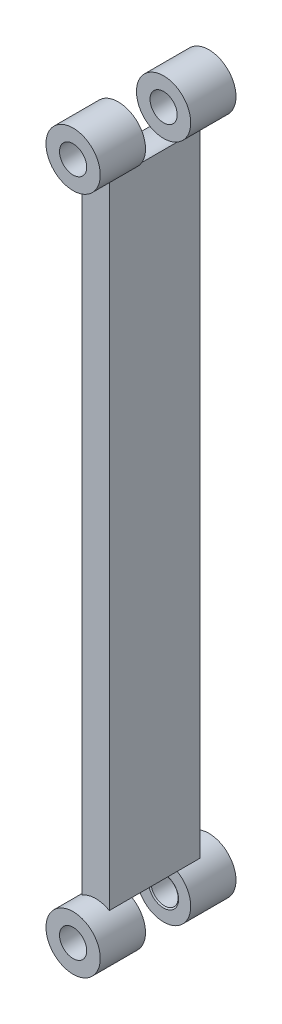
ISO-10303-21;
HEADER;
FILE_DESCRIPTION(('STEP AP214'),'2;1');
FILE_NAME('part.step','',(''),(''),'','','');
FILE_SCHEMA(('AUTOMOTIVE_DESIGN { 1 0 10303 214 1 1 1 1 }'));
ENDSEC;
DATA;
#1=APPLICATION_CONTEXT('core data for automotive mechanical design processes');
#2=APPLICATION_PROTOCOL_DEFINITION('international standard','automotive_design',2000,#1);
#3=PRODUCT_CONTEXT('',#1,'mechanical');
#4=PRODUCT('Part','Part','',(#3));
#5=PRODUCT_RELATED_PRODUCT_CATEGORY('part','',(#4));
#6=PRODUCT_DEFINITION_FORMATION('','',#4);
#7=PRODUCT_DEFINITION_CONTEXT('part definition',#1,'design');
#8=PRODUCT_DEFINITION('design','',#6,#7);
#9=PRODUCT_DEFINITION_SHAPE('','',#8);
#10=(LENGTH_UNIT() NAMED_UNIT(*) SI_UNIT(.MILLI.,.METRE.));
#11=(NAMED_UNIT(*) PLANE_ANGLE_UNIT() SI_UNIT($,.RADIAN.));
#12=(NAMED_UNIT(*) SI_UNIT($,.STERADIAN.) SOLID_ANGLE_UNIT());
#13=UNCERTAINTY_MEASURE_WITH_UNIT(LENGTH_MEASURE(1.E-05),#10,'distance_accuracy_value','');
#14=(GEOMETRIC_REPRESENTATION_CONTEXT(3) GLOBAL_UNCERTAINTY_ASSIGNED_CONTEXT((#13)) GLOBAL_UNIT_ASSIGNED_CONTEXT((#10,
#11,#12)) REPRESENTATION_CONTEXT('',''));
#15=CARTESIAN_POINT('',(0.,0.,0.));
#16=DIRECTION('',(0.,0.,1.));
#17=DIRECTION('',(1.,0.,0.));
#18=AXIS2_PLACEMENT_3D('',#15,#16,#17);
#19=CARTESIAN_POINT('',(0.,-37.5000000000002,2.5));
#20=DIRECTION('',(0.,0.,1.));
#21=DIRECTION('',(1.,0.,0.));
#22=AXIS2_PLACEMENT_3D('',#19,#20,#21);
#23=PLANE('',#22);
#24=CARTESIAN_POINT('',(0.,-37.5000000000002,2.5));
#25=DIRECTION('',(0.,0.,1.));
#26=DIRECTION('',(1.,0.,0.));
#27=AXIS2_PLACEMENT_3D('',#24,#25,#26);
#28=CIRCLE('',#27,3.);
#29=CARTESIAN_POINT('',(1.50000000000001,-34.9019237886469,2.5));
#30=VERTEX_POINT('',#29);
#31=CARTESIAN_POINT('',(-1.5,-34.9019237886468,2.5));
#32=VERTEX_POINT('',#31);
#33=EDGE_CURVE('E126',#30,#32,#28,.T.);
#34=ORIENTED_EDGE('',*,*,#33,.F.);
#35=EDGE_CURVE('E214',#32,#30,#28,.T.);
#36=ORIENTED_EDGE('',*,*,#35,.F.);
#37=EDGE_LOOP('',(#34,#36));
#38=FACE_BOUND('',#37,.T.);
#39=CARTESIAN_POINT('',(0.,-37.5000000000002,2.5));
#40=DIRECTION('',(0.,0.,1.));
#41=DIRECTION('',(1.,0.,0.));
#42=AXIS2_PLACEMENT_3D('',#39,#40,#41);
#43=CIRCLE('',#42,1.6583123951777);
#44=CARTESIAN_POINT('',(1.6583123951777,-37.5000000000002,2.5));
#45=VERTEX_POINT('',#44);
#46=EDGE_CURVE('E215',#45,#45,#43,.F.);
#47=ORIENTED_EDGE('',*,*,#46,.F.);
#48=EDGE_LOOP('',(#47));
#49=FACE_BOUND('',#48,.T.);
#50=ADVANCED_FACE('F56',(#38,#49),#23,.F.);
#51=CARTESIAN_POINT('',(0.,-37.5000000000002,-2.5));
#52=DIRECTION('',(0.,0.,1.));
#53=DIRECTION('',(1.,0.,0.));
#54=AXIS2_PLACEMENT_3D('',#51,#52,#53);
#55=PLANE('',#54);
#56=CARTESIAN_POINT('',(0.,-37.5000000000002,-2.5));
#57=DIRECTION('',(0.,0.,1.));
#58=DIRECTION('',(1.,0.,0.));
#59=AXIS2_PLACEMENT_3D('',#56,#57,#58);
#60=CIRCLE('',#59,3.);
#61=CARTESIAN_POINT('',(1.50000000000001,-34.9019237886469,-2.5));
#62=VERTEX_POINT('',#61);
#63=CARTESIAN_POINT('',(-1.5,-34.9019237886468,-2.5));
#64=VERTEX_POINT('',#63);
#65=EDGE_CURVE('E70',#62,#64,#60,.T.);
#66=ORIENTED_EDGE('',*,*,#65,.T.);
#67=EDGE_CURVE('E119',#64,#62,#60,.T.);
#68=ORIENTED_EDGE('',*,*,#67,.T.);
#69=EDGE_LOOP('',(#66,#68));
#70=FACE_BOUND('',#69,.T.);
#71=CARTESIAN_POINT('',(0.,-37.5000000000002,-2.5));
#72=DIRECTION('',(0.,0.,1.));
#73=DIRECTION('',(1.,0.,0.));
#74=AXIS2_PLACEMENT_3D('',#71,#72,#73);
#75=CIRCLE('',#74,1.6583123951777);
#76=CARTESIAN_POINT('',(1.6583123951777,-37.5000000000002,-2.5));
#77=VERTEX_POINT('',#76);
#78=EDGE_CURVE('E218',#77,#77,#75,.F.);
#79=ORIENTED_EDGE('',*,*,#78,.T.);
#80=EDGE_LOOP('',(#79));
#81=FACE_BOUND('',#80,.T.);
#82=ADVANCED_FACE('F120',(#70,#81),#55,.T.);
#83=CARTESIAN_POINT('',(0.,-37.5000000000002,-7.5));
#84=DIRECTION('',(0.,0.,1.));
#85=DIRECTION('',(1.,0.,0.));
#86=AXIS2_PLACEMENT_3D('',#83,#84,#85);
#87=CYLINDRICAL_SURFACE('',#86,1.5);
#88=CARTESIAN_POINT('',(0.,-37.5000000000002,-7.5));
#89=DIRECTION('',(0.,0.,1.));
#90=DIRECTION('',(1.,0.,0.));
#91=AXIS2_PLACEMENT_3D('',#88,#89,#90);
#92=CIRCLE('',#91,1.5);
#93=CARTESIAN_POINT('',(1.49999999999999,-37.5000000000002,-7.5));
#94=VERTEX_POINT('',#93);
#95=EDGE_CURVE('E165',#94,#94,#92,.T.);
#96=ORIENTED_EDGE('',*,*,#95,.F.);
#97=EDGE_LOOP('',(#96));
#98=FACE_BOUND('',#97,.T.);
#99=CARTESIAN_POINT('',(0.,-37.5000000000002,-2.59807621135332));
#100=DIRECTION('',(0.,0.,1.));
#101=DIRECTION('',(1.,0.,0.));
#102=AXIS2_PLACEMENT_3D('',#99,#100,#101);
#103=CIRCLE('',#102,1.5);
#104=CARTESIAN_POINT('',(1.49999999999999,-37.5000000000002,-2.59807621135332));
#105=VERTEX_POINT('',#104);
#106=EDGE_CURVE('E221',#105,#105,#103,.F.);
#107=ORIENTED_EDGE('',*,*,#106,.F.);
#108=EDGE_LOOP('',(#107));
#109=FACE_BOUND('',#108,.T.);
#110=ADVANCED_FACE('F234',(#98,#109),#87,.F.);
#111=CARTESIAN_POINT('',(0.,-37.5000000000002,7.5));
#112=DIRECTION('',(0.,0.,1.));
#113=DIRECTION('',(1.,0.,0.));
#114=AXIS2_PLACEMENT_3D('',#111,#112,#113);
#115=CIRCLE('',#114,1.5);
#116=CARTESIAN_POINT('',(1.49999999999999,-37.5000000000002,7.5));
#117=VERTEX_POINT('',#116);
#118=EDGE_CURVE('E174',#117,#117,#115,.T.);
#119=ORIENTED_EDGE('',*,*,#118,.T.);
#120=EDGE_LOOP('',(#119));
#121=FACE_BOUND('',#120,.T.);
#122=CARTESIAN_POINT('',(0.,-37.5000000000002,2.59807621135332));
#123=DIRECTION('',(0.,0.,-1.));
#124=DIRECTION('',(-1.,0.,0.));
#125=AXIS2_PLACEMENT_3D('',#122,#123,#124);
#126=CIRCLE('',#125,1.5);
#127=CARTESIAN_POINT('',(-1.50000000000001,-37.5000000000002,2.59807621135332));
#128=VERTEX_POINT('',#127);
#129=EDGE_CURVE('E224',#128,#128,#126,.F.);
#130=ORIENTED_EDGE('',*,*,#129,.F.);
#131=EDGE_LOOP('',(#130));
#132=FACE_BOUND('',#131,.T.);
#133=ADVANCED_FACE('F231',(#121,#132),#87,.F.);
#134=CARTESIAN_POINT('',(0.,37.4999999999998,2.5));
#135=DIRECTION('',(0.,0.,1.));
#136=DIRECTION('',(1.,0.,0.));
#137=AXIS2_PLACEMENT_3D('',#134,#135,#136);
#138=PLANE('',#137);
#139=CARTESIAN_POINT('',(0.,37.4999999999998,2.5));
#140=DIRECTION('',(0.,0.,1.));
#141=DIRECTION('',(1.,0.,0.));
#142=AXIS2_PLACEMENT_3D('',#139,#140,#141);
#143=CIRCLE('',#142,3.);
#144=CARTESIAN_POINT('',(-1.5,34.9019237886465,2.5));
#145=VERTEX_POINT('',#144);
#146=CARTESIAN_POINT('',(1.49999999999999,34.9019237886465,2.5));
#147=VERTEX_POINT('',#146);
#148=EDGE_CURVE('E208',#145,#147,#143,.T.);
#149=ORIENTED_EDGE('',*,*,#148,.F.);
#150=EDGE_CURVE('E211',#147,#145,#143,.T.);
#151=ORIENTED_EDGE('',*,*,#150,.F.);
#152=EDGE_LOOP('',(#149,#151));
#153=FACE_BOUND('',#152,.T.);
#154=CARTESIAN_POINT('',(0.,37.4999999999998,2.5));
#155=DIRECTION('',(0.,0.,1.));
#156=DIRECTION('',(1.,0.,0.));
#157=AXIS2_PLACEMENT_3D('',#154,#155,#156);
#158=CIRCLE('',#157,1.5);
#159=CARTESIAN_POINT('',(1.5,37.4999999999998,2.5));
#160=VERTEX_POINT('',#159);
#161=EDGE_CURVE('E202',#160,#160,#158,.F.);
#162=ORIENTED_EDGE('',*,*,#161,.F.);
#163=EDGE_LOOP('',(#162));
#164=FACE_BOUND('',#163,.T.);
#165=ADVANCED_FACE('F233',(#153,#164),#138,.F.);
#166=CARTESIAN_POINT('',(0.,37.4999999999998,-2.5));
#167=DIRECTION('',(0.,0.,1.));
#168=DIRECTION('',(1.,0.,0.));
#169=AXIS2_PLACEMENT_3D('',#166,#167,#168);
#170=PLANE('',#169);
#171=CARTESIAN_POINT('',(0.,37.4999999999998,-2.5));
#172=DIRECTION('',(0.,0.,1.));
#173=DIRECTION('',(1.,0.,0.));
#174=AXIS2_PLACEMENT_3D('',#171,#172,#173);
#175=CIRCLE('',#174,3.);
#176=CARTESIAN_POINT('',(-1.5,34.9019237886465,-2.5));
#177=VERTEX_POINT('',#176);
#178=CARTESIAN_POINT('',(1.5,34.9019237886465,-2.5));
#179=VERTEX_POINT('',#178);
#180=EDGE_CURVE('E77',#177,#179,#175,.T.);
#181=ORIENTED_EDGE('',*,*,#180,.T.);
#182=EDGE_CURVE('E135',#179,#177,#175,.T.);
#183=ORIENTED_EDGE('',*,*,#182,.T.);
#184=EDGE_LOOP('',(#181,#183));
#185=FACE_BOUND('',#184,.T.);
#186=CARTESIAN_POINT('',(0.,37.4999999999998,-2.5));
#187=DIRECTION('',(0.,0.,1.));
#188=DIRECTION('',(1.,0.,0.));
#189=AXIS2_PLACEMENT_3D('',#186,#187,#188);
#190=CIRCLE('',#189,1.5);
#191=CARTESIAN_POINT('',(1.5,37.4999999999998,-2.5));
#192=VERTEX_POINT('',#191);
#193=EDGE_CURVE('E205',#192,#192,#190,.F.);
#194=ORIENTED_EDGE('',*,*,#193,.T.);
#195=EDGE_LOOP('',(#194));
#196=FACE_BOUND('',#195,.T.);
#197=ADVANCED_FACE('F241',(#185,#196),#170,.T.);
#198=CARTESIAN_POINT('',(0.,-37.5000000000002,-7.5));
#199=DIRECTION('',(0.,0.,1.));
#200=DIRECTION('',(1.,0.,0.));
#201=AXIS2_PLACEMENT_3D('',#198,#199,#200);
#202=CYLINDRICAL_SURFACE('',#201,3.);
#203=CARTESIAN_POINT('',(0.,-37.5000000000002,-7.5));
#204=DIRECTION('',(0.,0.,1.));
#205=DIRECTION('',(1.,0.,0.));
#206=AXIS2_PLACEMENT_3D('',#203,#204,#205);
#207=CIRCLE('',#206,3.);
#208=CARTESIAN_POINT('',(2.99999999999999,-37.5000000000002,-7.5));
#209=VERTEX_POINT('',#208);
#210=EDGE_CURVE('E160',#209,#209,#207,.T.);
#211=ORIENTED_EDGE('',*,*,#210,.T.);
#212=EDGE_LOOP('',(#211));
#213=FACE_BOUND('',#212,.T.);
#214=DIRECTION('',(0.,0.,1.));
#215=VECTOR('',#214,1.);
#216=CARTESIAN_POINT('',(1.50000000000001,-34.9019237886469,-7.5));
#217=LINE('',#216,#215);
#218=CARTESIAN_POINT('',(1.50000000000001,-34.9019237886469,-5.));
#219=VERTEX_POINT('',#218);
#220=EDGE_CURVE('E140',#219,#62,#217,.T.);
#221=ORIENTED_EDGE('',*,*,#220,.T.);
#222=ORIENTED_EDGE('',*,*,#67,.F.);
#223=DIRECTION('',(0.,0.,1.));
#224=VECTOR('',#223,1.);
#225=CARTESIAN_POINT('',(-1.5,-34.9019237886468,-7.5));
#226=LINE('',#225,#224);
#227=CARTESIAN_POINT('',(-1.5,-34.9019237886468,-5.));
#228=VERTEX_POINT('',#227);
#229=EDGE_CURVE('E151',#228,#64,#226,.T.);
#230=ORIENTED_EDGE('',*,*,#229,.F.);
#231=CARTESIAN_POINT('',(0.,-37.5000000000002,-5.));
#232=DIRECTION('',(0.,0.,1.));
#233=DIRECTION('',(1.,0.,0.));
#234=AXIS2_PLACEMENT_3D('',#231,#232,#233);
#235=CIRCLE('',#234,3.);
#236=EDGE_CURVE('E147',#219,#228,#235,.T.);
#237=ORIENTED_EDGE('',*,*,#236,.F.);
#238=EDGE_LOOP('',(#221,#222,#230,#237));
#239=FACE_BOUND('',#238,.T.);
#240=ADVANCED_FACE('F146',(#213,#239),#202,.T.);
#241=CARTESIAN_POINT('',(0.,37.4999999999998,-7.5));
#242=DIRECTION('',(0.,0.,1.));
#243=DIRECTION('',(1.,0.,0.));
#244=AXIS2_PLACEMENT_3D('',#241,#242,#243);
#245=CYLINDRICAL_SURFACE('',#244,3.);
#246=CARTESIAN_POINT('',(0.,37.4999999999998,-7.5));
#247=DIRECTION('',(0.,0.,1.));
#248=DIRECTION('',(1.,0.,0.));
#249=AXIS2_PLACEMENT_3D('',#246,#247,#248);
#250=CIRCLE('',#249,3.);
#251=CARTESIAN_POINT('',(3.,37.4999999999998,-7.5));
#252=VERTEX_POINT('',#251);
#253=EDGE_CURVE('E199',#252,#252,#250,.T.);
#254=ORIENTED_EDGE('',*,*,#253,.T.);
#255=EDGE_LOOP('',(#254));
#256=FACE_BOUND('',#255,.T.);
#257=DIRECTION('',(0.,0.,1.));
#258=VECTOR('',#257,1.);
#259=CARTESIAN_POINT('',(-1.5,34.9019237886465,-7.5));
#260=LINE('',#259,#258);
#261=CARTESIAN_POINT('',(-1.5,34.9019237886465,-5.));
#262=VERTEX_POINT('',#261);
#263=EDGE_CURVE('E189',#177,#262,#260,.F.);
#264=ORIENTED_EDGE('',*,*,#263,.F.);
#265=ORIENTED_EDGE('',*,*,#182,.F.);
#266=DIRECTION('',(0.,0.,1.));
#267=VECTOR('',#266,1.);
#268=CARTESIAN_POINT('',(1.5,34.9019237886465,-7.5));
#269=LINE('',#268,#267);
#270=CARTESIAN_POINT('',(1.5,34.9019237886465,-5.));
#271=VERTEX_POINT('',#270);
#272=EDGE_CURVE('E184',#179,#271,#269,.F.);
#273=ORIENTED_EDGE('',*,*,#272,.T.);
#274=CARTESIAN_POINT('',(0.,37.4999999999998,-5.));
#275=DIRECTION('',(0.,0.,1.));
#276=DIRECTION('',(1.,0.,0.));
#277=AXIS2_PLACEMENT_3D('',#274,#275,#276);
#278=CIRCLE('',#277,3.);
#279=EDGE_CURVE('E177',#262,#271,#278,.T.);
#280=ORIENTED_EDGE('',*,*,#279,.F.);
#281=EDGE_LOOP('',(#264,#265,#273,#280));
#282=FACE_BOUND('',#281,.T.);
#283=ADVANCED_FACE('F271',(#256,#282),#245,.T.);
#284=CARTESIAN_POINT('',(0.,37.4999999999998,-7.5));
#285=DIRECTION('',(0.,0.,1.));
#286=DIRECTION('',(1.,0.,0.));
#287=AXIS2_PLACEMENT_3D('',#284,#285,#286);
#288=CYLINDRICAL_SURFACE('',#287,1.5);
#289=ORIENTED_EDGE('',*,*,#193,.F.);
#290=EDGE_LOOP('',(#289));
#291=FACE_BOUND('',#290,.T.);
#292=CARTESIAN_POINT('',(0.,37.4999999999998,-7.5));
#293=DIRECTION('',(0.,0.,1.));
#294=DIRECTION('',(1.,0.,0.));
#295=AXIS2_PLACEMENT_3D('',#292,#293,#294);
#296=CIRCLE('',#295,1.5);
#297=CARTESIAN_POINT('',(1.5,37.4999999999998,-7.5));
#298=VERTEX_POINT('',#297);
#299=EDGE_CURVE('E196',#298,#298,#296,.T.);
#300=ORIENTED_EDGE('',*,*,#299,.F.);
#301=EDGE_LOOP('',(#300));
#302=FACE_BOUND('',#301,.T.);
#303=ADVANCED_FACE('F279',(#291,#302),#288,.F.);
#304=CARTESIAN_POINT('',(1.50000000000001,-37.5000000000002,-5.));
#305=DIRECTION('',(1.,0.,0.));
#306=DIRECTION('',(0.,1.,0.));
#307=AXIS2_PLACEMENT_3D('',#304,#305,#306);
#308=PLANE('',#307);
#309=CARTESIAN_POINT('',(1.5,34.9019237886465,5.));
#310=VERTEX_POINT('',#309);
#311=EDGE_CURVE('E180',#310,#147,#269,.F.);
#312=ORIENTED_EDGE('',*,*,#311,.F.);
#313=DIRECTION('',(0.,1.,0.));
#314=VECTOR('',#313,1.);
#315=CARTESIAN_POINT('',(1.50000000000001,-37.5000000000002,5.));
#316=LINE('',#315,#314);
#317=CARTESIAN_POINT('',(1.50000000000001,-34.9019237886469,5.));
#318=VERTEX_POINT('',#317);
#319=EDGE_CURVE('E148',#318,#310,#316,.T.);
#320=ORIENTED_EDGE('',*,*,#319,.F.);
#321=EDGE_CURVE('E143',#30,#318,#217,.T.);
#322=ORIENTED_EDGE('',*,*,#321,.F.);
#323=EDGE_CURVE('E132',#62,#30,#217,.T.);
#324=ORIENTED_EDGE('',*,*,#323,.F.);
#325=ORIENTED_EDGE('',*,*,#220,.F.);
#326=DIRECTION('',(0.,1.,0.));
#327=VECTOR('',#326,1.);
#328=CARTESIAN_POINT('',(1.50000000000001,-37.5000000000002,-5.));
#329=LINE('',#328,#327);
#330=EDGE_CURVE('E328',#219,#271,#329,.T.);
#331=ORIENTED_EDGE('',*,*,#330,.T.);
#332=ORIENTED_EDGE('',*,*,#272,.F.);
#333=EDGE_CURVE('E183',#147,#179,#269,.F.);
#334=ORIENTED_EDGE('',*,*,#333,.F.);
#335=EDGE_LOOP('',(#312,#320,#322,#324,#325,#331,#332,#334));
#336=FACE_BOUND('',#335,.T.);
#337=ADVANCED_FACE('F58',(#336),#308,.T.);
#338=CARTESIAN_POINT('',(-1.5,-37.5000000000002,-5.));
#339=DIRECTION('',(1.,0.,0.));
#340=DIRECTION('',(0.,0.,-1.));
#341=AXIS2_PLACEMENT_3D('',#338,#339,#340);
#342=PLANE('',#341);
#343=DIRECTION('',(0.,1.,0.));
#344=VECTOR('',#343,1.);
#345=CARTESIAN_POINT('',(-1.5,-37.5000000000002,5.));
#346=LINE('',#345,#344);
#347=CARTESIAN_POINT('',(-1.5,-34.9019237886468,5.));
#348=VERTEX_POINT('',#347);
#349=CARTESIAN_POINT('',(-1.5,34.9019237886465,5.));
#350=VERTEX_POINT('',#349);
#351=EDGE_CURVE('E330',#348,#350,#346,.T.);
#352=ORIENTED_EDGE('',*,*,#351,.T.);
#353=EDGE_CURVE('E185',#350,#145,#260,.F.);
#354=ORIENTED_EDGE('',*,*,#353,.T.);
#355=EDGE_CURVE('E188',#145,#177,#260,.F.);
#356=ORIENTED_EDGE('',*,*,#355,.T.);
#357=ORIENTED_EDGE('',*,*,#263,.T.);
#358=DIRECTION('',(0.,1.,0.));
#359=VECTOR('',#358,1.);
#360=CARTESIAN_POINT('',(-1.5,-37.5000000000002,-5.));
#361=LINE('',#360,#359);
#362=EDGE_CURVE('E329',#228,#262,#361,.T.);
#363=ORIENTED_EDGE('',*,*,#362,.F.);
#364=ORIENTED_EDGE('',*,*,#229,.T.);
#365=EDGE_CURVE('E134',#64,#32,#226,.T.);
#366=ORIENTED_EDGE('',*,*,#365,.T.);
#367=EDGE_CURVE('E156',#32,#348,#226,.T.);
#368=ORIENTED_EDGE('',*,*,#367,.T.);
#369=EDGE_LOOP('',(#352,#354,#356,#357,#363,#364,#366,#368));
#370=FACE_BOUND('',#369,.T.);
#371=ADVANCED_FACE('F320',(#370),#342,.F.);
#372=CARTESIAN_POINT('',(0.,0.,-5.));
#373=DIRECTION('',(0.,0.,1.));
#374=DIRECTION('',(1.,0.,0.));
#375=AXIS2_PLACEMENT_3D('',#372,#373,#374);
#376=PLANE('',#375);
#377=ORIENTED_EDGE('',*,*,#362,.T.);
#378=ORIENTED_EDGE('',*,*,#279,.T.);
#379=ORIENTED_EDGE('',*,*,#330,.F.);
#380=ORIENTED_EDGE('',*,*,#236,.T.);
#381=EDGE_LOOP('',(#377,#378,#379,#380));
#382=FACE_BOUND('',#381,.T.);
#383=ADVANCED_FACE('F300',(#382),#376,.F.);
#384=CARTESIAN_POINT('',(0.,0.,5.));
#385=DIRECTION('',(0.,0.,1.));
#386=DIRECTION('',(1.,0.,0.));
#387=AXIS2_PLACEMENT_3D('',#384,#385,#386);
#388=PLANE('',#387);
#389=CARTESIAN_POINT('',(0.,37.4999999999998,5.));
#390=DIRECTION('',(0.,0.,1.));
#391=DIRECTION('',(1.,0.,0.));
#392=AXIS2_PLACEMENT_3D('',#389,#390,#391);
#393=CIRCLE('',#392,3.);
#394=EDGE_CURVE('E12',#350,#310,#393,.T.);
#395=ORIENTED_EDGE('',*,*,#394,.F.);
#396=ORIENTED_EDGE('',*,*,#351,.F.);
#397=CARTESIAN_POINT('',(0.,-37.5000000000002,5.));
#398=DIRECTION('',(0.,0.,1.));
#399=DIRECTION('',(1.,0.,0.));
#400=AXIS2_PLACEMENT_3D('',#397,#398,#399);
#401=CIRCLE('',#400,3.);
#402=EDGE_CURVE('E64',#318,#348,#401,.T.);
#403=ORIENTED_EDGE('',*,*,#402,.F.);
#404=ORIENTED_EDGE('',*,*,#319,.T.);
#405=EDGE_LOOP('',(#395,#396,#403,#404));
#406=FACE_BOUND('',#405,.T.);
#407=ADVANCED_FACE('F295',(#406),#388,.T.);
#408=ORIENTED_EDGE('',*,*,#35,.T.);
#409=ORIENTED_EDGE('',*,*,#321,.T.);
#410=ORIENTED_EDGE('',*,*,#402,.T.);
#411=ORIENTED_EDGE('',*,*,#367,.F.);
#412=EDGE_LOOP('',(#408,#409,#410,#411));
#413=FACE_BOUND('',#412,.T.);
#414=CARTESIAN_POINT('',(0.,-37.5000000000002,7.5));
#415=DIRECTION('',(0.,0.,1.));
#416=DIRECTION('',(1.,0.,0.));
#417=AXIS2_PLACEMENT_3D('',#414,#415,#416);
#418=CIRCLE('',#417,3.);
#419=CARTESIAN_POINT('',(2.99999999999999,-37.5000000000002,7.5));
#420=VERTEX_POINT('',#419);
#421=EDGE_CURVE('E169',#420,#420,#418,.T.);
#422=ORIENTED_EDGE('',*,*,#421,.F.);
#423=EDGE_LOOP('',(#422));
#424=FACE_BOUND('',#423,.T.);
#425=ADVANCED_FACE('F288',(#413,#424),#202,.T.);
#426=CARTESIAN_POINT('',(0.,-37.5000000000002,-7.5));
#427=DIRECTION('',(0.,0.,1.));
#428=DIRECTION('',(1.,0.,0.));
#429=AXIS2_PLACEMENT_3D('',#426,#427,#428);
#430=PLANE('',#429);
#431=ORIENTED_EDGE('',*,*,#95,.T.);
#432=EDGE_LOOP('',(#431));
#433=FACE_BOUND('',#432,.T.);
#434=ORIENTED_EDGE('',*,*,#210,.F.);
#435=EDGE_LOOP('',(#434));
#436=FACE_BOUND('',#435,.T.);
#437=ADVANCED_FACE('F283',(#433,#436),#430,.F.);
#438=CARTESIAN_POINT('',(0.,-37.5000000000002,7.5));
#439=DIRECTION('',(0.,0.,1.));
#440=DIRECTION('',(1.,0.,0.));
#441=AXIS2_PLACEMENT_3D('',#438,#439,#440);
#442=PLANE('',#441);
#443=ORIENTED_EDGE('',*,*,#421,.T.);
#444=EDGE_LOOP('',(#443));
#445=FACE_BOUND('',#444,.T.);
#446=ORIENTED_EDGE('',*,*,#118,.F.);
#447=EDGE_LOOP('',(#446));
#448=FACE_BOUND('',#447,.T.);
#449=ADVANCED_FACE('F269',(#445,#448),#442,.T.);
#450=ORIENTED_EDGE('',*,*,#150,.T.);
#451=ORIENTED_EDGE('',*,*,#353,.F.);
#452=ORIENTED_EDGE('',*,*,#394,.T.);
#453=ORIENTED_EDGE('',*,*,#311,.T.);
#454=EDGE_LOOP('',(#450,#451,#452,#453));
#455=FACE_BOUND('',#454,.T.);
#456=CARTESIAN_POINT('',(0.,37.4999999999998,7.5));
#457=DIRECTION('',(0.,0.,1.));
#458=DIRECTION('',(1.,0.,0.));
#459=AXIS2_PLACEMENT_3D('',#456,#457,#458);
#460=CIRCLE('',#459,3.);
#461=CARTESIAN_POINT('',(3.,37.4999999999998,7.5));
#462=VERTEX_POINT('',#461);
#463=EDGE_CURVE('E193',#462,#462,#460,.T.);
#464=ORIENTED_EDGE('',*,*,#463,.F.);
#465=EDGE_LOOP('',(#464));
#466=FACE_BOUND('',#465,.T.);
#467=ADVANCED_FACE('F265',(#455,#466),#245,.T.);
#468=CARTESIAN_POINT('',(0.,37.4999999999998,7.5));
#469=DIRECTION('',(0.,0.,1.));
#470=DIRECTION('',(1.,0.,0.));
#471=AXIS2_PLACEMENT_3D('',#468,#469,#470);
#472=CIRCLE('',#471,1.5);
#473=CARTESIAN_POINT('',(1.5,37.4999999999998,7.5));
#474=VERTEX_POINT('',#473);
#475=EDGE_CURVE('E190',#474,#474,#472,.T.);
#476=ORIENTED_EDGE('',*,*,#475,.T.);
#477=EDGE_LOOP('',(#476));
#478=FACE_BOUND('',#477,.T.);
#479=ORIENTED_EDGE('',*,*,#161,.T.);
#480=EDGE_LOOP('',(#479));
#481=FACE_BOUND('',#480,.T.);
#482=ADVANCED_FACE('F268',(#478,#481),#288,.F.);
#483=CARTESIAN_POINT('',(0.,37.4999999999998,-7.5));
#484=DIRECTION('',(0.,0.,1.));
#485=DIRECTION('',(1.,0.,0.));
#486=AXIS2_PLACEMENT_3D('',#483,#484,#485);
#487=PLANE('',#486);
#488=ORIENTED_EDGE('',*,*,#299,.T.);
#489=EDGE_LOOP('',(#488));
#490=FACE_BOUND('',#489,.T.);
#491=ORIENTED_EDGE('',*,*,#253,.F.);
#492=EDGE_LOOP('',(#491));
#493=FACE_BOUND('',#492,.T.);
#494=ADVANCED_FACE('F272',(#490,#493),#487,.F.);
#495=CARTESIAN_POINT('',(0.,37.4999999999998,7.5));
#496=DIRECTION('',(0.,0.,1.));
#497=DIRECTION('',(1.,0.,0.));
#498=AXIS2_PLACEMENT_3D('',#495,#496,#497);
#499=PLANE('',#498);
#500=ORIENTED_EDGE('',*,*,#463,.T.);
#501=EDGE_LOOP('',(#500));
#502=FACE_BOUND('',#501,.T.);
#503=ORIENTED_EDGE('',*,*,#475,.F.);
#504=EDGE_LOOP('',(#503));
#505=FACE_BOUND('',#504,.T.);
#506=ADVANCED_FACE('F263',(#502,#505),#499,.T.);
#507=CARTESIAN_POINT('',(0.,37.4999999999998,2.5));
#508=DIRECTION('',(0.,0.,-1.));
#509=DIRECTION('',(-1.,0.,0.));
#510=AXIS2_PLACEMENT_3D('',#507,#508,#509);
#511=CYLINDRICAL_SURFACE('',#510,3.);
#512=ORIENTED_EDGE('',*,*,#180,.F.);
#513=ORIENTED_EDGE('',*,*,#355,.F.);
#514=ORIENTED_EDGE('',*,*,#148,.T.);
#515=ORIENTED_EDGE('',*,*,#333,.T.);
#516=EDGE_LOOP('',(#512,#513,#514,#515));
#517=FACE_BOUND('',#516,.T.);
#518=ADVANCED_FACE('F260',(#517),#511,.F.);
#519=CARTESIAN_POINT('',(0.,-37.5000000000002,2.5));
#520=DIRECTION('',(0.,0.,-1.));
#521=DIRECTION('',(-1.,0.,0.));
#522=AXIS2_PLACEMENT_3D('',#519,#520,#521);
#523=CYLINDRICAL_SURFACE('',#522,3.);
#524=ORIENTED_EDGE('',*,*,#323,.T.);
#525=ORIENTED_EDGE('',*,*,#33,.T.);
#526=ORIENTED_EDGE('',*,*,#365,.F.);
#527=ORIENTED_EDGE('',*,*,#65,.F.);
#528=EDGE_LOOP('',(#524,#525,#526,#527));
#529=FACE_BOUND('',#528,.T.);
#530=ADVANCED_FACE('F130',(#529),#523,.F.);
#531=CARTESIAN_POINT('',(0.,-37.5000000000002,0.));
#532=DIRECTION('',(1.,0.,0.));
#533=DIRECTION('',(0.,-1.,0.));
#534=AXIS2_PLACEMENT_3D('',#531,#532,#533);
#535=SPHERICAL_SURFACE('',#534,3.);
#536=CARTESIAN_POINT('',(0.,-37.5000000000002,0.));
#537=DIRECTION('',(0.,0.,-1.));
#538=DIRECTION('',(-1.,0.,0.));
#539=AXIS2_PLACEMENT_3D('',#536,#537,#538);
#540=SPHERICAL_SURFACE('',#539,3.);
#541=ORIENTED_EDGE('',*,*,#129,.T.);
#542=EDGE_LOOP('',(#541));
#543=FACE_BOUND('',#542,.T.);
#544=ORIENTED_EDGE('',*,*,#46,.T.);
#545=EDGE_LOOP('',(#544));
#546=FACE_BOUND('',#545,.T.);
#547=ADVANCED_FACE('F228',(#543,#546),#540,.F.);
#548=CARTESIAN_POINT('',(0.,-37.5000000000002,0.));
#549=DIRECTION('',(0.,0.,1.));
#550=DIRECTION('',(1.,0.,0.));
#551=AXIS2_PLACEMENT_3D('',#548,#549,#550);
#552=SPHERICAL_SURFACE('',#551,3.);
#553=ORIENTED_EDGE('',*,*,#78,.F.);
#554=EDGE_LOOP('',(#553));
#555=FACE_BOUND('',#554,.T.);
#556=ORIENTED_EDGE('',*,*,#106,.T.);
#557=EDGE_LOOP('',(#556));
#558=FACE_BOUND('',#557,.T.);
#559=ADVANCED_FACE('F399',(#555,#558),#552,.F.);
#560=CLOSED_SHELL('',(#50,#82,#110,#133,#165,#197,#240,#283,#303,#337,#371,#383,#407,#425,#437,
#449,#467,#482,#494,#506,#518,#530,#547,#559));
#561=MANIFOLD_SOLID_BREP('B2',#560);
#562=ADVANCED_BREP_SHAPE_REPRESENTATION('',(#18,#561),#14);
#563=SHAPE_DEFINITION_REPRESENTATION(#9,#562);
ENDSEC;
END-ISO-10303-21;
